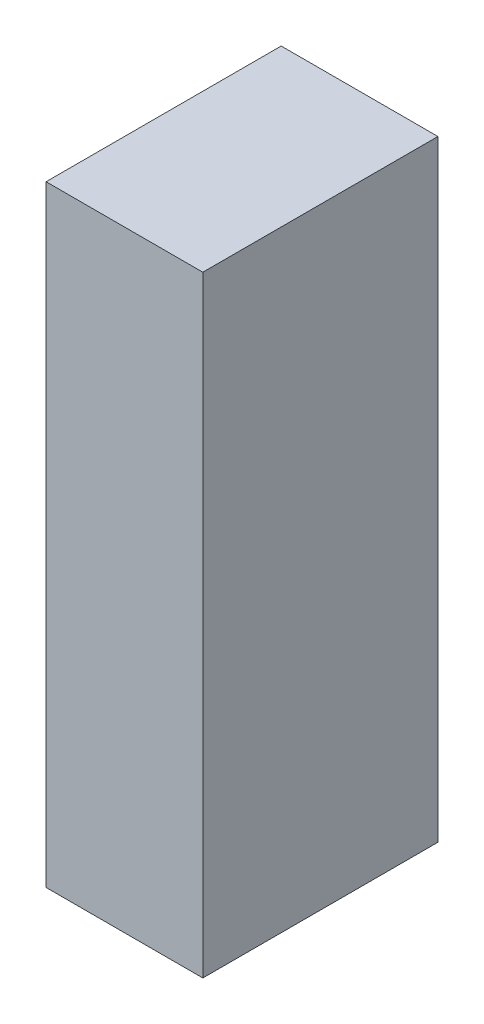
ISO-10303-21;
HEADER;
FILE_DESCRIPTION(('STEP AP214'),'2;1');
FILE_NAME('part.step','',(''),(''),'','','');
FILE_SCHEMA(('AUTOMOTIVE_DESIGN { 1 0 10303 214 1 1 1 1 }'));
ENDSEC;
DATA;
#1=APPLICATION_CONTEXT('core data for automotive mechanical design processes');
#2=APPLICATION_PROTOCOL_DEFINITION('international standard','automotive_design',2000,#1);
#3=PRODUCT_CONTEXT('',#1,'mechanical');
#4=PRODUCT('Part','Part','',(#3));
#5=PRODUCT_RELATED_PRODUCT_CATEGORY('part','',(#4));
#6=PRODUCT_DEFINITION_FORMATION('','',#4);
#7=PRODUCT_DEFINITION_CONTEXT('part definition',#1,'design');
#8=PRODUCT_DEFINITION('design','',#6,#7);
#9=PRODUCT_DEFINITION_SHAPE('','',#8);
#10=(LENGTH_UNIT() NAMED_UNIT(*) SI_UNIT(.MILLI.,.METRE.));
#11=(NAMED_UNIT(*) PLANE_ANGLE_UNIT() SI_UNIT($,.RADIAN.));
#12=(NAMED_UNIT(*) SI_UNIT($,.STERADIAN.) SOLID_ANGLE_UNIT());
#13=UNCERTAINTY_MEASURE_WITH_UNIT(LENGTH_MEASURE(1.E-05),#10,'distance_accuracy_value','');
#14=(GEOMETRIC_REPRESENTATION_CONTEXT(3) GLOBAL_UNCERTAINTY_ASSIGNED_CONTEXT((#13)) GLOBAL_UNIT_ASSIGNED_CONTEXT((#10,
#11,#12)) REPRESENTATION_CONTEXT('',''));
#15=CARTESIAN_POINT('',(0.,0.,0.));
#16=DIRECTION('',(0.,0.,1.));
#17=DIRECTION('',(1.,0.,0.));
#18=AXIS2_PLACEMENT_3D('',#15,#16,#17);
#19=CARTESIAN_POINT('',(-17.124595338245,-96.9999999979545,39.9256723210965));
#20=DIRECTION('',(0.,0.,-1.));
#21=DIRECTION('',(-1.,0.,0.));
#22=AXIS2_PLACEMENT_3D('',#19,#20,#21);
#23=PLANE('',#22);
#24=DIRECTION('',(0.,-1.,0.));
#25=VECTOR('',#24,1.);
#26=CARTESIAN_POINT('',(-27.124595338245,-96.9999999979545,39.9256723210965));
#27=LINE('',#26,#25);
#28=CARTESIAN_POINT('',(-27.124595338245,-57.9999999979545,39.9256723210965));
#29=VERTEX_POINT('',#28);
#30=CARTESIAN_POINT('',(-27.124595338245,-96.9999999979545,39.9256723210965));
#31=VERTEX_POINT('',#30);
#32=EDGE_CURVE('E98',#29,#31,#27,.T.);
#33=ORIENTED_EDGE('',*,*,#32,.T.);
#34=DIRECTION('',(-1.,0.,0.));
#35=VECTOR('',#34,1.);
#36=CARTESIAN_POINT('',(-17.124595338245,-96.9999999979545,39.9256723210965));
#37=LINE('',#36,#35);
#38=CARTESIAN_POINT('',(-17.124595338245,-96.9999999979545,39.9256723210965));
#39=VERTEX_POINT('',#38);
#40=EDGE_CURVE('E11',#39,#31,#37,.T.);
#41=ORIENTED_EDGE('',*,*,#40,.F.);
#42=DIRECTION('',(0.,-1.,0.));
#43=VECTOR('',#42,1.);
#44=CARTESIAN_POINT('',(-17.124595338245,-96.9999999979545,39.9256723210965));
#45=LINE('',#44,#43);
#46=CARTESIAN_POINT('',(-17.124595338245,-57.9999999979545,39.9256723210965));
#47=VERTEX_POINT('',#46);
#48=EDGE_CURVE('E86',#47,#39,#45,.T.);
#49=ORIENTED_EDGE('',*,*,#48,.F.);
#50=DIRECTION('',(-1.,0.,0.));
#51=VECTOR('',#50,1.);
#52=CARTESIAN_POINT('',(-17.124595338245,-57.9999999979545,39.9256723210965));
#53=LINE('',#52,#51);
#54=EDGE_CURVE('E94',#47,#29,#53,.T.);
#55=ORIENTED_EDGE('',*,*,#54,.T.);
#56=EDGE_LOOP('',(#33,#41,#49,#55));
#57=FACE_BOUND('',#56,.T.);
#58=ADVANCED_FACE('F35',(#57),#23,.F.);
#59=CARTESIAN_POINT('',(-17.124595338245,-96.9999999979545,39.9256723210965));
#60=DIRECTION('',(0.,1.,0.));
#61=DIRECTION('',(-1.,0.,0.));
#62=AXIS2_PLACEMENT_3D('',#59,#60,#61);
#63=PLANE('',#62);
#64=DIRECTION('',(0.,0.,-1.));
#65=VECTOR('',#64,1.);
#66=CARTESIAN_POINT('',(-27.124595338245,-96.9999999979545,39.9256723210965));
#67=LINE('',#66,#65);
#68=CARTESIAN_POINT('',(-27.124595338245,-96.9999999979545,24.9256723210965));
#69=VERTEX_POINT('',#68);
#70=EDGE_CURVE('E90',#31,#69,#67,.T.);
#71=ORIENTED_EDGE('',*,*,#70,.T.);
#72=DIRECTION('',(-1.,0.,0.));
#73=VECTOR('',#72,1.);
#74=CARTESIAN_POINT('',(-17.124595338245,-96.9999999979545,24.9256723210965));
#75=LINE('',#74,#73);
#76=CARTESIAN_POINT('',(-17.124595338245,-96.9999999979545,24.9256723210965));
#77=VERTEX_POINT('',#76);
#78=EDGE_CURVE('E43',#77,#69,#75,.T.);
#79=ORIENTED_EDGE('',*,*,#78,.F.);
#80=DIRECTION('',(0.,0.,-1.));
#81=VECTOR('',#80,1.);
#82=CARTESIAN_POINT('',(-17.124595338245,-96.9999999979545,39.9256723210965));
#83=LINE('',#82,#81);
#84=EDGE_CURVE('E81',#39,#77,#83,.T.);
#85=ORIENTED_EDGE('',*,*,#84,.F.);
#86=ORIENTED_EDGE('',*,*,#40,.T.);
#87=EDGE_LOOP('',(#71,#79,#85,#86));
#88=FACE_BOUND('',#87,.T.);
#89=ADVANCED_FACE('F89',(#88),#63,.F.);
#90=CARTESIAN_POINT('',(-17.124595338245,-96.9999999979545,24.9256723210965));
#91=DIRECTION('',(0.,0.,1.));
#92=DIRECTION('',(1.,0.,0.));
#93=AXIS2_PLACEMENT_3D('',#90,#91,#92);
#94=PLANE('',#93);
#95=DIRECTION('',(0.,1.,0.));
#96=VECTOR('',#95,1.);
#97=CARTESIAN_POINT('',(-27.124595338245,-96.9999999979545,24.9256723210965));
#98=LINE('',#97,#96);
#99=CARTESIAN_POINT('',(-27.124595338245,-57.9999999979545,24.9256723210965));
#100=VERTEX_POINT('',#99);
#101=EDGE_CURVE('E68',#69,#100,#98,.T.);
#102=ORIENTED_EDGE('',*,*,#101,.T.);
#103=DIRECTION('',(-1.,0.,0.));
#104=VECTOR('',#103,1.);
#105=CARTESIAN_POINT('',(-17.124595338245,-57.9999999979545,24.9256723210965));
#106=LINE('',#105,#104);
#107=CARTESIAN_POINT('',(-17.124595338245,-57.9999999979545,24.9256723210965));
#108=VERTEX_POINT('',#107);
#109=EDGE_CURVE('E91',#108,#100,#106,.T.);
#110=ORIENTED_EDGE('',*,*,#109,.F.);
#111=DIRECTION('',(0.,1.,0.));
#112=VECTOR('',#111,1.);
#113=CARTESIAN_POINT('',(-17.124595338245,-96.9999999979545,24.9256723210965));
#114=LINE('',#113,#112);
#115=EDGE_CURVE('E84',#77,#108,#114,.T.);
#116=ORIENTED_EDGE('',*,*,#115,.F.);
#117=ORIENTED_EDGE('',*,*,#78,.T.);
#118=EDGE_LOOP('',(#102,#110,#116,#117));
#119=FACE_BOUND('',#118,.T.);
#120=ADVANCED_FACE('F92',(#119),#94,.F.);
#121=CARTESIAN_POINT('',(-17.124595338245,-57.9999999979545,39.9256723210965));
#122=DIRECTION('',(0.,-1.,0.));
#123=DIRECTION('',(0.,0.,-1.));
#124=AXIS2_PLACEMENT_3D('',#121,#122,#123);
#125=PLANE('',#124);
#126=DIRECTION('',(0.,0.,1.));
#127=VECTOR('',#126,1.);
#128=CARTESIAN_POINT('',(-27.124595338245,-57.9999999979545,39.9256723210965));
#129=LINE('',#128,#127);
#130=EDGE_CURVE('E74',#100,#29,#129,.T.);
#131=ORIENTED_EDGE('',*,*,#130,.T.);
#132=ORIENTED_EDGE('',*,*,#54,.F.);
#133=DIRECTION('',(0.,0.,1.));
#134=VECTOR('',#133,1.);
#135=CARTESIAN_POINT('',(-17.124595338245,-57.9999999979545,39.9256723210965));
#136=LINE('',#135,#134);
#137=EDGE_CURVE('E51',#108,#47,#136,.T.);
#138=ORIENTED_EDGE('',*,*,#137,.F.);
#139=ORIENTED_EDGE('',*,*,#109,.T.);
#140=EDGE_LOOP('',(#131,#132,#138,#139));
#141=FACE_BOUND('',#140,.T.);
#142=ADVANCED_FACE('F105',(#141),#125,.F.);
#143=CARTESIAN_POINT('',(-17.124595338245,0.,0.));
#144=DIRECTION('',(-1.,0.,0.));
#145=DIRECTION('',(0.,-1.,0.));
#146=AXIS2_PLACEMENT_3D('',#143,#144,#145);
#147=PLANE('',#146);
#148=ORIENTED_EDGE('',*,*,#48,.T.);
#149=ORIENTED_EDGE('',*,*,#84,.T.);
#150=ORIENTED_EDGE('',*,*,#115,.T.);
#151=ORIENTED_EDGE('',*,*,#137,.T.);
#152=EDGE_LOOP('',(#148,#149,#150,#151));
#153=FACE_BOUND('',#152,.T.);
#154=ADVANCED_FACE('F82',(#153),#147,.F.);
#155=CARTESIAN_POINT('',(-27.124595338245,0.,0.));
#156=DIRECTION('',(-1.,0.,0.));
#157=DIRECTION('',(0.,-1.,0.));
#158=AXIS2_PLACEMENT_3D('',#155,#156,#157);
#159=PLANE('',#158);
#160=ORIENTED_EDGE('',*,*,#32,.F.);
#161=ORIENTED_EDGE('',*,*,#130,.F.);
#162=ORIENTED_EDGE('',*,*,#101,.F.);
#163=ORIENTED_EDGE('',*,*,#70,.F.);
#164=EDGE_LOOP('',(#160,#161,#162,#163));
#165=FACE_BOUND('',#164,.T.);
#166=ADVANCED_FACE('F108',(#165),#159,.T.);
#167=CLOSED_SHELL('',(#58,#89,#120,#142,#154,#166));
#168=MANIFOLD_SOLID_BREP('B2',#167);
#169=ADVANCED_BREP_SHAPE_REPRESENTATION('',(#18,#168),#14);
#170=SHAPE_DEFINITION_REPRESENTATION(#9,#169);
ENDSEC;
END-ISO-10303-21;
